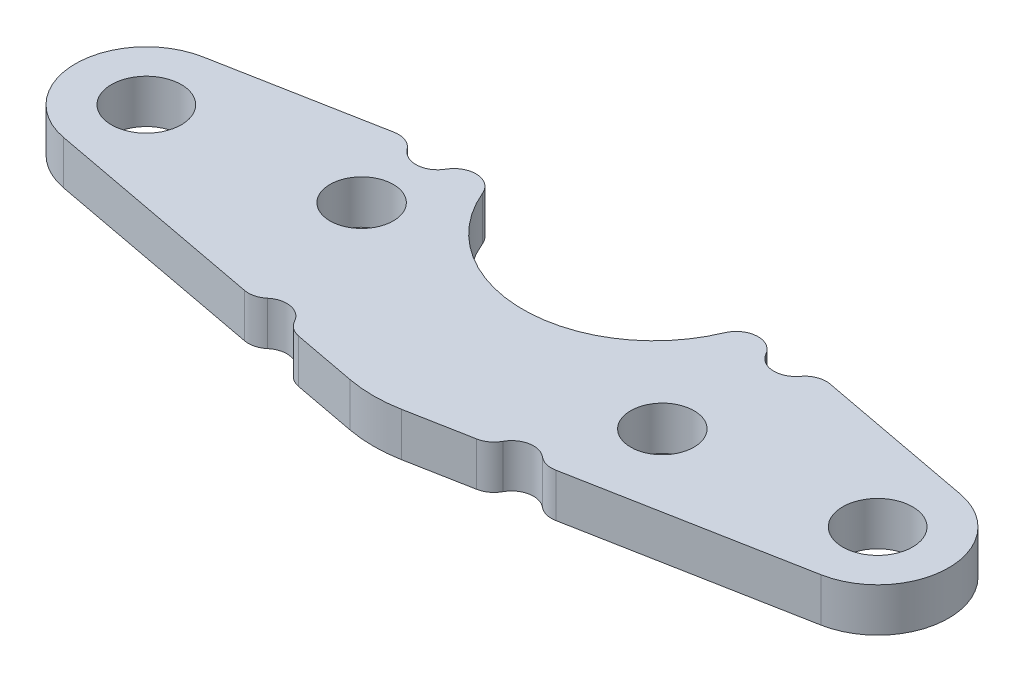
ISO-10303-21;
HEADER;
FILE_DESCRIPTION(('STEP AP214'),'2;1');
FILE_NAME('part.step','',(''),(''),'','','');
FILE_SCHEMA(('AUTOMOTIVE_DESIGN { 1 0 10303 214 1 1 1 1 }'));
ENDSEC;
DATA;
#1=APPLICATION_CONTEXT('core data for automotive mechanical design processes');
#2=APPLICATION_PROTOCOL_DEFINITION('international standard','automotive_design',2000,#1);
#3=PRODUCT_CONTEXT('',#1,'mechanical');
#4=PRODUCT('Part','Part','',(#3));
#5=PRODUCT_RELATED_PRODUCT_CATEGORY('part','',(#4));
#6=PRODUCT_DEFINITION_FORMATION('','',#4);
#7=PRODUCT_DEFINITION_CONTEXT('part definition',#1,'design');
#8=PRODUCT_DEFINITION('design','',#6,#7);
#9=PRODUCT_DEFINITION_SHAPE('','',#8);
#10=(LENGTH_UNIT() NAMED_UNIT(*) SI_UNIT(.MILLI.,.METRE.));
#11=(NAMED_UNIT(*) PLANE_ANGLE_UNIT() SI_UNIT($,.RADIAN.));
#12=(NAMED_UNIT(*) SI_UNIT($,.STERADIAN.) SOLID_ANGLE_UNIT());
#13=UNCERTAINTY_MEASURE_WITH_UNIT(LENGTH_MEASURE(1.E-05),#10,'distance_accuracy_value','');
#14=(GEOMETRIC_REPRESENTATION_CONTEXT(3) GLOBAL_UNCERTAINTY_ASSIGNED_CONTEXT((#13)) GLOBAL_UNIT_ASSIGNED_CONTEXT((#10,
#11,#12)) REPRESENTATION_CONTEXT('',''));
#15=CARTESIAN_POINT('',(0.,0.,0.));
#16=DIRECTION('',(0.,0.,1.));
#17=DIRECTION('',(1.,0.,0.));
#18=AXIS2_PLACEMENT_3D('',#15,#16,#17);
#19=CARTESIAN_POINT('',(-9.80076612799552,0.,-3.59802218391572));
#20=DIRECTION('',(0.,1.,0.));
#21=DIRECTION('',(0.,0.,1.));
#22=AXIS2_PLACEMENT_3D('',#19,#20,#21);
#23=CYLINDRICAL_SURFACE('',#22,1.);
#24=CARTESIAN_POINT('',(-9.80076612799552,0.,-3.59802218391572));
#25=DIRECTION('',(0.,1.,0.));
#26=DIRECTION('',(0.,0.,1.));
#27=AXIS2_PLACEMENT_3D('',#24,#25,#26);
#28=CIRCLE('',#27,1.);
#29=CARTESIAN_POINT('',(-9.00038306399776,0.,-4.19751109195786));
#30=VERTEX_POINT('',#29);
#31=CARTESIAN_POINT('',(-9.9858063465176,0.,-4.58075313261394));
#32=VERTEX_POINT('',#31);
#33=EDGE_CURVE('E20',#30,#32,#28,.T.);
#34=ORIENTED_EDGE('',*,*,#33,.T.);
#35=DIRECTION('',(0.,1.,0.));
#36=VECTOR('',#35,1.);
#37=CARTESIAN_POINT('',(-9.9858063465176,0.,-4.58075313261394));
#38=LINE('',#37,#36);
#39=CARTESIAN_POINT('',(-9.9858063465176,2.,-4.58075313261394));
#40=VERTEX_POINT('',#39);
#41=EDGE_CURVE('E167',#40,#32,#38,.F.);
#42=ORIENTED_EDGE('',*,*,#41,.F.);
#43=CARTESIAN_POINT('',(-9.80076612799552,2.,-3.59802218391572));
#44=DIRECTION('',(0.,1.,0.));
#45=DIRECTION('',(0.,0.,1.));
#46=AXIS2_PLACEMENT_3D('',#43,#44,#45);
#47=CIRCLE('',#46,1.);
#48=CARTESIAN_POINT('',(-9.00038306399776,2.,-4.19751109195786));
#49=VERTEX_POINT('',#48);
#50=EDGE_CURVE('E345',#49,#40,#47,.T.);
#51=ORIENTED_EDGE('',*,*,#50,.F.);
#52=DIRECTION('',(0.,1.,0.));
#53=VECTOR('',#52,1.);
#54=CARTESIAN_POINT('',(-9.00038306399776,0.,-4.19751109195786));
#55=LINE('',#54,#53);
#56=EDGE_CURVE('E169',#49,#30,#55,.F.);
#57=ORIENTED_EDGE('',*,*,#56,.T.);
#58=EDGE_LOOP('',(#34,#42,#51,#57));
#59=FACE_BOUND('',#58,.T.);
#60=ADVANCED_FACE('F17',(#59),#23,.T.);
#61=CARTESIAN_POINT('',(-6.94101291776606,0.,4.13649037771896));
#62=DIRECTION('',(0.,1.,0.));
#63=DIRECTION('',(0.,0.,1.));
#64=AXIS2_PLACEMENT_3D('',#61,#62,#63);
#65=CYLINDRICAL_SURFACE('',#64,1.);
#66=CARTESIAN_POINT('',(-6.94101291776606,0.,4.13649037771896));
#67=DIRECTION('',(0.,1.,0.));
#68=DIRECTION('',(0.,0.,1.));
#69=AXIS2_PLACEMENT_3D('',#66,#67,#68);
#70=CIRCLE('',#69,1.);
#71=CARTESIAN_POINT('',(-7.12605313628814,0.,5.11922132641718));
#72=VERTEX_POINT('',#71);
#73=CARTESIAN_POINT('',(-6.29550645888303,0.,4.90024518885948));
#74=VERTEX_POINT('',#73);
#75=EDGE_CURVE('E171',#72,#74,#70,.T.);
#76=ORIENTED_EDGE('',*,*,#75,.T.);
#77=DIRECTION('',(0.,1.,0.));
#78=VECTOR('',#77,1.);
#79=CARTESIAN_POINT('',(-6.29550645888303,0.,4.90024518885948));
#80=LINE('',#79,#78);
#81=CARTESIAN_POINT('',(-6.29550645888303,2.,4.90024518885948));
#82=VERTEX_POINT('',#81);
#83=EDGE_CURVE('E244',#74,#82,#80,.T.);
#84=ORIENTED_EDGE('',*,*,#83,.T.);
#85=CARTESIAN_POINT('',(-6.94101291776606,2.,4.13649037771896));
#86=DIRECTION('',(0.,1.,0.));
#87=DIRECTION('',(0.,0.,1.));
#88=AXIS2_PLACEMENT_3D('',#85,#86,#87);
#89=CIRCLE('',#88,1.);
#90=CARTESIAN_POINT('',(-7.12605313628814,2.,5.11922132641719));
#91=VERTEX_POINT('',#90);
#92=EDGE_CURVE('E343',#91,#82,#89,.T.);
#93=ORIENTED_EDGE('',*,*,#92,.F.);
#94=DIRECTION('',(0.,1.,0.));
#95=VECTOR('',#94,1.);
#96=CARTESIAN_POINT('',(-7.12605313628814,0.,5.11922132641719));
#97=LINE('',#96,#95);
#98=EDGE_CURVE('E254',#72,#91,#97,.T.);
#99=ORIENTED_EDGE('',*,*,#98,.F.);
#100=EDGE_LOOP('',(#76,#84,#93,#99));
#101=FACE_BOUND('',#100,.T.);
#102=ADVANCED_FACE('F357',(#101),#65,.T.);
#103=CARTESIAN_POINT('',(-3.89185613414746,0.,4.71062171885181));
#104=DIRECTION('',(0.,1.,0.));
#105=DIRECTION('',(0.,0.,1.));
#106=AXIS2_PLACEMENT_3D('',#103,#104,#105);
#107=CYLINDRICAL_SURFACE('',#106,1.);
#108=CARTESIAN_POINT('',(-3.89185613414746,0.,4.71062171885181));
#109=DIRECTION('',(0.,1.,0.));
#110=DIRECTION('',(0.,0.,1.));
#111=AXIS2_PLACEMENT_3D('',#108,#109,#110);
#112=CIRCLE('',#111,1.);
#113=CARTESIAN_POINT('',(-4.77092806707373,0.,5.1873108594259));
#114=VERTEX_POINT('',#113);
#115=CARTESIAN_POINT('',(-4.07689635266954,0.,5.69335266755003));
#116=VERTEX_POINT('',#115);
#117=EDGE_CURVE('E353',#114,#116,#112,.T.);
#118=ORIENTED_EDGE('',*,*,#117,.T.);
#119=DIRECTION('',(0.,1.,0.));
#120=VECTOR('',#119,1.);
#121=CARTESIAN_POINT('',(-4.07689635266954,0.,5.69335266755003));
#122=LINE('',#121,#120);
#123=CARTESIAN_POINT('',(-4.07689635266954,2.,5.69335266755003));
#124=VERTEX_POINT('',#123);
#125=EDGE_CURVE('E240',#124,#116,#122,.F.);
#126=ORIENTED_EDGE('',*,*,#125,.F.);
#127=CARTESIAN_POINT('',(-3.89185613414746,2.,4.71062171885181));
#128=DIRECTION('',(0.,1.,0.));
#129=DIRECTION('',(0.,0.,1.));
#130=AXIS2_PLACEMENT_3D('',#127,#128,#129);
#131=CIRCLE('',#130,1.);
#132=CARTESIAN_POINT('',(-4.77092806707373,2.,5.1873108594259));
#133=VERTEX_POINT('',#132);
#134=EDGE_CURVE('E341',#133,#124,#131,.T.);
#135=ORIENTED_EDGE('',*,*,#134,.F.);
#136=DIRECTION('',(0.,1.,0.));
#137=VECTOR('',#136,1.);
#138=CARTESIAN_POINT('',(-4.77092806707373,0.,5.1873108594259));
#139=LINE('',#138,#137);
#140=EDGE_CURVE('E245',#133,#114,#139,.F.);
#141=ORIENTED_EDGE('',*,*,#140,.T.);
#142=EDGE_LOOP('',(#118,#126,#135,#141));
#143=FACE_BOUND('',#142,.T.);
#144=ADVANCED_FACE('F370',(#143),#107,.T.);
#145=CARTESIAN_POINT('',(3.89185613414746,0.,4.71062171885181));
#146=DIRECTION('',(0.,1.,0.));
#147=DIRECTION('',(0.,0.,1.));
#148=AXIS2_PLACEMENT_3D('',#145,#146,#147);
#149=CYLINDRICAL_SURFACE('',#148,1.);
#150=CARTESIAN_POINT('',(3.89185613414746,0.,4.71062171885181));
#151=DIRECTION('',(0.,1.,0.));
#152=DIRECTION('',(0.,0.,1.));
#153=AXIS2_PLACEMENT_3D('',#150,#151,#152);
#154=CIRCLE('',#153,1.);
#155=CARTESIAN_POINT('',(4.07689635266954,0.,5.69335266755003));
#156=VERTEX_POINT('',#155);
#157=CARTESIAN_POINT('',(4.77092806707373,0.,5.1873108594259));
#158=VERTEX_POINT('',#157);
#159=EDGE_CURVE('E351',#156,#158,#154,.T.);
#160=ORIENTED_EDGE('',*,*,#159,.T.);
#161=DIRECTION('',(0.,1.,0.));
#162=VECTOR('',#161,1.);
#163=CARTESIAN_POINT('',(4.77092806707373,0.,5.1873108594259));
#164=LINE('',#163,#162);
#165=CARTESIAN_POINT('',(4.77092806707373,2.,5.1873108594259));
#166=VERTEX_POINT('',#165);
#167=EDGE_CURVE('E229',#158,#166,#164,.T.);
#168=ORIENTED_EDGE('',*,*,#167,.T.);
#169=CARTESIAN_POINT('',(3.89185613414746,2.,4.71062171885181));
#170=DIRECTION('',(0.,1.,0.));
#171=DIRECTION('',(0.,0.,1.));
#172=AXIS2_PLACEMENT_3D('',#169,#170,#171);
#173=CIRCLE('',#172,1.);
#174=CARTESIAN_POINT('',(4.07689635266954,2.,5.69335266755003));
#175=VERTEX_POINT('',#174);
#176=EDGE_CURVE('E339',#175,#166,#173,.T.);
#177=ORIENTED_EDGE('',*,*,#176,.F.);
#178=DIRECTION('',(0.,1.,0.));
#179=VECTOR('',#178,1.);
#180=CARTESIAN_POINT('',(4.07689635266954,0.,5.69335266755003));
#181=LINE('',#180,#179);
#182=EDGE_CURVE('E235',#156,#175,#181,.T.);
#183=ORIENTED_EDGE('',*,*,#182,.F.);
#184=EDGE_LOOP('',(#160,#168,#177,#183));
#185=FACE_BOUND('',#184,.T.);
#186=ADVANCED_FACE('F439',(#185),#149,.T.);
#187=CARTESIAN_POINT('',(6.94101291776606,0.,4.13649037771896));
#188=DIRECTION('',(0.,1.,0.));
#189=DIRECTION('',(0.,0.,1.));
#190=AXIS2_PLACEMENT_3D('',#187,#188,#189);
#191=CYLINDRICAL_SURFACE('',#190,1.);
#192=CARTESIAN_POINT('',(6.94101291776606,0.,4.13649037771896));
#193=DIRECTION('',(0.,1.,0.));
#194=DIRECTION('',(0.,0.,1.));
#195=AXIS2_PLACEMENT_3D('',#192,#193,#194);
#196=CIRCLE('',#195,1.);
#197=CARTESIAN_POINT('',(6.29550645888303,0.,4.90024518885948));
#198=VERTEX_POINT('',#197);
#199=CARTESIAN_POINT('',(7.12605313628814,0.,5.11922132641718));
#200=VERTEX_POINT('',#199);
#201=EDGE_CURVE('E349',#198,#200,#196,.T.);
#202=ORIENTED_EDGE('',*,*,#201,.T.);
#203=DIRECTION('',(0.,1.,0.));
#204=VECTOR('',#203,1.);
#205=CARTESIAN_POINT('',(7.12605313628814,0.,5.11922132641718));
#206=LINE('',#205,#204);
#207=CARTESIAN_POINT('',(7.12605313628814,2.,5.11922132641718));
#208=VERTEX_POINT('',#207);
#209=EDGE_CURVE('E221',#208,#200,#206,.F.);
#210=ORIENTED_EDGE('',*,*,#209,.F.);
#211=CARTESIAN_POINT('',(6.94101291776606,2.,4.13649037771896));
#212=DIRECTION('',(0.,1.,0.));
#213=DIRECTION('',(0.,0.,1.));
#214=AXIS2_PLACEMENT_3D('',#211,#212,#213);
#215=CIRCLE('',#214,1.);
#216=CARTESIAN_POINT('',(6.29550645888303,2.,4.90024518885948));
#217=VERTEX_POINT('',#216);
#218=EDGE_CURVE('E337',#217,#208,#215,.T.);
#219=ORIENTED_EDGE('',*,*,#218,.F.);
#220=DIRECTION('',(0.,1.,0.));
#221=VECTOR('',#220,1.);
#222=CARTESIAN_POINT('',(6.29550645888303,0.,4.90024518885948));
#223=LINE('',#222,#221);
#224=EDGE_CURVE('E225',#217,#198,#223,.F.);
#225=ORIENTED_EDGE('',*,*,#224,.T.);
#226=EDGE_LOOP('',(#202,#210,#219,#225));
#227=FACE_BOUND('',#226,.T.);
#228=ADVANCED_FACE('F445',(#227),#191,.T.);
#229=CARTESIAN_POINT('',(9.80076612799552,0.,-3.59802218391572));
#230=DIRECTION('',(0.,1.,0.));
#231=DIRECTION('',(0.,0.,1.));
#232=AXIS2_PLACEMENT_3D('',#229,#230,#231);
#233=CYLINDRICAL_SURFACE('',#232,1.);
#234=CARTESIAN_POINT('',(9.80076612799552,0.,-3.59802218391572));
#235=DIRECTION('',(0.,1.,0.));
#236=DIRECTION('',(0.,0.,1.));
#237=AXIS2_PLACEMENT_3D('',#234,#235,#236);
#238=CIRCLE('',#237,1.);
#239=CARTESIAN_POINT('',(9.9858063465176,0.,-4.58075313261394));
#240=VERTEX_POINT('',#239);
#241=CARTESIAN_POINT('',(9.00038306399776,0.,-4.19751109195786));
#242=VERTEX_POINT('',#241);
#243=EDGE_CURVE('E347',#240,#242,#238,.T.);
#244=ORIENTED_EDGE('',*,*,#243,.T.);
#245=DIRECTION('',(0.,1.,0.));
#246=VECTOR('',#245,1.);
#247=CARTESIAN_POINT('',(9.00038306399776,0.,-4.19751109195786));
#248=LINE('',#247,#246);
#249=CARTESIAN_POINT('',(9.00038306399776,2.,-4.19751109195786));
#250=VERTEX_POINT('',#249);
#251=EDGE_CURVE('E209',#242,#250,#248,.T.);
#252=ORIENTED_EDGE('',*,*,#251,.T.);
#253=CARTESIAN_POINT('',(9.80076612799552,2.,-3.59802218391572));
#254=DIRECTION('',(0.,1.,0.));
#255=DIRECTION('',(0.,0.,1.));
#256=AXIS2_PLACEMENT_3D('',#253,#254,#255);
#257=CIRCLE('',#256,1.);
#258=CARTESIAN_POINT('',(9.9858063465176,2.,-4.58075313261395));
#259=VERTEX_POINT('',#258);
#260=EDGE_CURVE('E335',#259,#250,#257,.T.);
#261=ORIENTED_EDGE('',*,*,#260,.F.);
#262=DIRECTION('',(0.,1.,0.));
#263=VECTOR('',#262,1.);
#264=CARTESIAN_POINT('',(9.9858063465176,0.,-4.58075313261395));
#265=LINE('',#264,#263);
#266=EDGE_CURVE('E216',#240,#259,#265,.T.);
#267=ORIENTED_EDGE('',*,*,#266,.F.);
#268=EDGE_LOOP('',(#244,#252,#261,#267));
#269=FACE_BOUND('',#268,.T.);
#270=ADVANCED_FACE('F399',(#269),#233,.T.);
#271=CARTESIAN_POINT('',(-16.75,2.,0.));
#272=DIRECTION('',(0.,1.,0.));
#273=DIRECTION('',(0.,0.,1.));
#274=AXIS2_PLACEMENT_3D('',#271,#272,#273);
#275=PLANE('',#274);
#276=CARTESIAN_POINT('',(-16.75,2.,0.));
#277=DIRECTION('',(0.,1.,0.));
#278=DIRECTION('',(0.,0.,1.));
#279=AXIS2_PLACEMENT_3D('',#276,#277,#278);
#280=CIRCLE('',#279,1.6);
#281=CARTESIAN_POINT('',(-16.75,2.,1.6));
#282=VERTEX_POINT('',#281);
#283=EDGE_CURVE('E191',#282,#282,#280,.F.);
#284=ORIENTED_EDGE('',*,*,#283,.T.);
#285=EDGE_LOOP('',(#284));
#286=FACE_BOUND('',#285,.T.);
#287=CARTESIAN_POINT('',(16.75,2.,0.));
#288=DIRECTION('',(0.,1.,0.));
#289=DIRECTION('',(0.,0.,1.));
#290=AXIS2_PLACEMENT_3D('',#287,#288,#289);
#291=CIRCLE('',#290,1.6);
#292=CARTESIAN_POINT('',(16.75,2.,1.6));
#293=VERTEX_POINT('',#292);
#294=EDGE_CURVE('E309',#293,#293,#291,.F.);
#295=ORIENTED_EDGE('',*,*,#294,.T.);
#296=EDGE_LOOP('',(#295));
#297=FACE_BOUND('',#296,.T.);
#298=CARTESIAN_POINT('',(7.93155889099048,2.,1.04420953776041));
#299=DIRECTION('',(0.,1.,0.));
#300=DIRECTION('',(0.,0.,1.));
#301=AXIS2_PLACEMENT_3D('',#298,#299,#300);
#302=CIRCLE('',#301,1.45);
#303=CARTESIAN_POINT('',(7.93155889099048,2.,2.49420953776041));
#304=VERTEX_POINT('',#303);
#305=EDGE_CURVE('E313',#304,#304,#302,.F.);
#306=ORIENTED_EDGE('',*,*,#305,.T.);
#307=EDGE_LOOP('',(#306));
#308=FACE_BOUND('',#307,.T.);
#309=CARTESIAN_POINT('',(-7.93155889099048,2.,-1.04420953776041));
#310=DIRECTION('',(0.,1.,0.));
#311=DIRECTION('',(0.,0.,1.));
#312=AXIS2_PLACEMENT_3D('',#309,#310,#311);
#313=CIRCLE('',#312,1.45);
#314=CARTESIAN_POINT('',(-7.93155889099048,2.,0.40579046223959));
#315=VERTEX_POINT('',#314);
#316=EDGE_CURVE('E197',#315,#315,#313,.F.);
#317=ORIENTED_EDGE('',*,*,#316,.T.);
#318=EDGE_LOOP('',(#317));
#319=FACE_BOUND('',#318,.T.);
#320=CARTESIAN_POINT('',(6.46165739404907,2.,-3.80797776347762));
#321=DIRECTION('',(0.,1.,0.));
#322=DIRECTION('',(0.,0.,1.));
#323=AXIS2_PLACEMENT_3D('',#320,#321,#322);
#324=CIRCLE('',#323,1.);
#325=CARTESIAN_POINT('',(5.53856348061349,2.,-4.1925523686951));
#326=VERTEX_POINT('',#325);
#327=CARTESIAN_POINT('',(7.33082869702453,2.,-4.30248888173881));
#328=VERTEX_POINT('',#327);
#329=EDGE_CURVE('E208',#326,#328,#324,.F.);
#330=ORIENTED_EDGE('',*,*,#329,.F.);
#331=CARTESIAN_POINT('',(0.,2.,-6.5));
#332=DIRECTION('',(0.,1.,0.));
#333=DIRECTION('',(0.,0.,1.));
#334=AXIS2_PLACEMENT_3D('',#331,#332,#333);
#335=CIRCLE('',#334,6.);
#336=CARTESIAN_POINT('',(-5.53856348061349,2.,-4.1925523686951));
#337=VERTEX_POINT('',#336);
#338=EDGE_CURVE('E202',#326,#337,#335,.F.);
#339=ORIENTED_EDGE('',*,*,#338,.T.);
#340=CARTESIAN_POINT('',(-6.46165739404907,2.,-3.80797776347762));
#341=DIRECTION('',(0.,1.,0.));
#342=DIRECTION('',(0.,0.,1.));
#343=AXIS2_PLACEMENT_3D('',#340,#341,#342);
#344=CIRCLE('',#343,0.999999999999999);
#345=CARTESIAN_POINT('',(-7.33082869702453,2.,-4.30248888173881));
#346=VERTEX_POINT('',#345);
#347=EDGE_CURVE('E198',#346,#337,#344,.F.);
#348=ORIENTED_EDGE('',*,*,#347,.F.);
#349=CARTESIAN_POINT('',(-8.2,2.,-4.797));
#350=DIRECTION('',(0.,1.,0.));
#351=DIRECTION('',(0.,0.,1.));
#352=AXIS2_PLACEMENT_3D('',#349,#350,#351);
#353=CIRCLE('',#352,1.);
#354=EDGE_CURVE('E260',#346,#49,#353,.F.);
#355=ORIENTED_EDGE('',*,*,#354,.T.);
#356=ORIENTED_EDGE('',*,*,#50,.T.);
#357=DIRECTION('',(-0.982730948698219,0.,0.185040218522078));
#358=VECTOR('',#357,1.);
#359=CARTESIAN_POINT('',(-9.19769539700239,2.,-4.72914799339564));
#360=LINE('',#359,#358);
#361=CARTESIAN_POINT('',(-17.3513807101968,2.,-3.19387558326921));
#362=VERTEX_POINT('',#361);
#363=EDGE_CURVE('E179',#362,#40,#360,.F.);
#364=ORIENTED_EDGE('',*,*,#363,.F.);
#365=CARTESIAN_POINT('',(-16.75,2.,0.));
#366=DIRECTION('',(0.,1.,0.));
#367=DIRECTION('',(0.,0.,1.));
#368=AXIS2_PLACEMENT_3D('',#365,#366,#367);
#369=CIRCLE('',#368,3.25);
#370=CARTESIAN_POINT('',(-17.3513807101968,2.,3.19387558326921));
#371=VERTEX_POINT('',#370);
#372=EDGE_CURVE('E257',#371,#362,#369,.F.);
#373=ORIENTED_EDGE('',*,*,#372,.F.);
#374=DIRECTION('',(0.982730948698219,0.,0.185040218522078));
#375=VECTOR('',#374,1.);
#376=CARTESIAN_POINT('',(-17.3513807101968,2.,3.19387558326921));
#377=LINE('',#376,#375);
#378=EDGE_CURVE('E253',#91,#371,#377,.F.);
#379=ORIENTED_EDGE('',*,*,#378,.F.);
#380=ORIENTED_EDGE('',*,*,#92,.T.);
#381=CARTESIAN_POINT('',(-5.65,2.,5.664));
#382=DIRECTION('',(0.,1.,0.));
#383=DIRECTION('',(0.,0.,1.));
#384=AXIS2_PLACEMENT_3D('',#381,#382,#383);
#385=CIRCLE('',#384,1.);
#386=EDGE_CURVE('E248',#82,#133,#385,.F.);
#387=ORIENTED_EDGE('',*,*,#386,.T.);
#388=ORIENTED_EDGE('',*,*,#134,.T.);
#389=DIRECTION('',(0.982730948698219,0.,0.185040218522078));
#390=VECTOR('',#389,1.);
#391=CARTESIAN_POINT('',(-4.65313718558666,2.,5.58485122085643));
#392=LINE('',#391,#390);
#393=CARTESIAN_POINT('',(-1.17489874158095,2.,6.2397751373193));
#394=VERTEX_POINT('',#393);
#395=EDGE_CURVE('E243',#394,#124,#392,.F.);
#396=ORIENTED_EDGE('',*,*,#395,.F.);
#397=CARTESIAN_POINT('',(0.,2.,0.));
#398=DIRECTION('',(0.,1.,0.));
#399=DIRECTION('',(0.,0.,1.));
#400=AXIS2_PLACEMENT_3D('',#397,#398,#399);
#401=CIRCLE('',#400,6.34942366024481);
#402=CARTESIAN_POINT('',(1.17489874158095,2.,6.2397751373193));
#403=VERTEX_POINT('',#402);
#404=EDGE_CURVE('E239',#403,#394,#401,.F.);
#405=ORIENTED_EDGE('',*,*,#404,.F.);
#406=DIRECTION('',(0.982730948698219,0.,-0.185040218522078));
#407=VECTOR('',#406,1.);
#408=CARTESIAN_POINT('',(1.17489874158095,2.,6.2397751373193));
#409=LINE('',#408,#407);
#410=EDGE_CURVE('E234',#175,#403,#409,.F.);
#411=ORIENTED_EDGE('',*,*,#410,.F.);
#412=ORIENTED_EDGE('',*,*,#176,.T.);
#413=CARTESIAN_POINT('',(5.65,2.,5.664));
#414=DIRECTION('',(0.,1.,0.));
#415=DIRECTION('',(0.,0.,1.));
#416=AXIS2_PLACEMENT_3D('',#413,#414,#415);
#417=CIRCLE('',#416,1.);
#418=EDGE_CURVE('E228',#166,#217,#417,.F.);
#419=ORIENTED_EDGE('',*,*,#418,.T.);
#420=ORIENTED_EDGE('',*,*,#218,.T.);
#421=DIRECTION('',(0.982730948698219,0.,-0.185040218522078));
#422=VECTOR('',#421,1.);
#423=CARTESIAN_POINT('',(6.54981230337102,2.,5.22772277311078));
#424=LINE('',#423,#422);
#425=CARTESIAN_POINT('',(17.3513807101968,2.,3.19387558326921));
#426=VERTEX_POINT('',#425);
#427=EDGE_CURVE('E224',#426,#208,#424,.F.);
#428=ORIENTED_EDGE('',*,*,#427,.F.);
#429=CARTESIAN_POINT('',(16.75,2.,0.));
#430=DIRECTION('',(0.,1.,0.));
#431=DIRECTION('',(0.,0.,1.));
#432=AXIS2_PLACEMENT_3D('',#429,#430,#431);
#433=CIRCLE('',#432,3.25);
#434=CARTESIAN_POINT('',(17.3513807101968,2.,-3.19387558326921));
#435=VERTEX_POINT('',#434);
#436=EDGE_CURVE('E220',#435,#426,#433,.F.);
#437=ORIENTED_EDGE('',*,*,#436,.F.);
#438=DIRECTION('',(-0.982730948698219,0.,-0.185040218522078));
#439=VECTOR('',#438,1.);
#440=CARTESIAN_POINT('',(17.3513807101968,2.,-3.19387558326921));
#441=LINE('',#440,#439);
#442=EDGE_CURVE('E215',#259,#435,#441,.F.);
#443=ORIENTED_EDGE('',*,*,#442,.F.);
#444=ORIENTED_EDGE('',*,*,#260,.T.);
#445=CARTESIAN_POINT('',(8.2,2.,-4.797));
#446=DIRECTION('',(0.,1.,0.));
#447=DIRECTION('',(0.,0.,1.));
#448=AXIS2_PLACEMENT_3D('',#445,#446,#447);
#449=CIRCLE('',#448,1.);
#450=EDGE_CURVE('E212',#250,#328,#449,.F.);
#451=ORIENTED_EDGE('',*,*,#450,.T.);
#452=EDGE_LOOP('',(#330,#339,#348,#355,#356,#364,#373,#379,#380,#387,#388,#396,#405,#411,#412,
#419,#420,#428,#437,#443,#444,#451));
#453=FACE_BOUND('',#452,.T.);
#454=ADVANCED_FACE('F372',(#286,#297,#308,#319,#453),#275,.T.);
#455=CARTESIAN_POINT('',(-8.2,0.,-4.797));
#456=DIRECTION('',(0.,1.,0.));
#457=DIRECTION('',(0.,0.,1.));
#458=AXIS2_PLACEMENT_3D('',#455,#456,#457);
#459=CYLINDRICAL_SURFACE('',#458,1.);
#460=CARTESIAN_POINT('',(-8.2,0.,-4.797));
#461=DIRECTION('',(0.,1.,0.));
#462=DIRECTION('',(0.,0.,1.));
#463=AXIS2_PLACEMENT_3D('',#460,#461,#462);
#464=CIRCLE('',#463,1.);
#465=CARTESIAN_POINT('',(-7.33082869702453,0.,-4.30248888173881));
#466=VERTEX_POINT('',#465);
#467=EDGE_CURVE('E187',#466,#30,#464,.F.);
#468=ORIENTED_EDGE('',*,*,#467,.T.);
#469=ORIENTED_EDGE('',*,*,#56,.F.);
#470=ORIENTED_EDGE('',*,*,#354,.F.);
#471=DIRECTION('',(0.,1.,0.));
#472=VECTOR('',#471,1.);
#473=CARTESIAN_POINT('',(-7.33082869702453,0.,-4.30248888173881));
#474=LINE('',#473,#472);
#475=EDGE_CURVE('E199',#466,#346,#474,.T.);
#476=ORIENTED_EDGE('',*,*,#475,.F.);
#477=EDGE_LOOP('',(#468,#469,#470,#476));
#478=FACE_BOUND('',#477,.T.);
#479=ADVANCED_FACE('F383',(#478),#459,.F.);
#480=CARTESIAN_POINT('',(-9.19769539700239,0.,-4.72914799339564));
#481=DIRECTION('',(-0.185040218522078,0.,-0.982730948698219));
#482=DIRECTION('',(-0.982730948698219,0.,0.185040218522078));
#483=AXIS2_PLACEMENT_3D('',#480,#481,#482);
#484=PLANE('',#483);
#485=DIRECTION('',(0.,1.,0.));
#486=VECTOR('',#485,1.);
#487=CARTESIAN_POINT('',(-17.3513807101968,0.,-3.1938755832692));
#488=LINE('',#487,#486);
#489=CARTESIAN_POINT('',(-17.3513807101968,0.,-3.19387558326921));
#490=VERTEX_POINT('',#489);
#491=EDGE_CURVE('E256',#362,#490,#488,.F.);
#492=ORIENTED_EDGE('',*,*,#491,.F.);
#493=ORIENTED_EDGE('',*,*,#363,.T.);
#494=ORIENTED_EDGE('',*,*,#41,.T.);
#495=DIRECTION('',(-0.982730948698219,0.,0.185040218522077));
#496=VECTOR('',#495,1.);
#497=CARTESIAN_POINT('',(-9.9858063465176,0.,-4.58075313261394));
#498=LINE('',#497,#496);
#499=EDGE_CURVE('E177',#32,#490,#498,.T.);
#500=ORIENTED_EDGE('',*,*,#499,.T.);
#501=EDGE_LOOP('',(#492,#493,#494,#500));
#502=FACE_BOUND('',#501,.T.);
#503=ADVANCED_FACE('F176',(#502),#484,.T.);
#504=CARTESIAN_POINT('',(-16.75,0.,0.));
#505=DIRECTION('',(0.,1.,0.));
#506=DIRECTION('',(0.,0.,1.));
#507=AXIS2_PLACEMENT_3D('',#504,#505,#506);
#508=CYLINDRICAL_SURFACE('',#507,3.25);
#509=ORIENTED_EDGE('',*,*,#372,.T.);
#510=ORIENTED_EDGE('',*,*,#491,.T.);
#511=CARTESIAN_POINT('',(-16.75,0.,0.));
#512=DIRECTION('',(0.,1.,0.));
#513=DIRECTION('',(0.,0.,1.));
#514=AXIS2_PLACEMENT_3D('',#511,#512,#513);
#515=CIRCLE('',#514,3.25);
#516=CARTESIAN_POINT('',(-17.3513807101968,0.,3.19387558326921));
#517=VERTEX_POINT('',#516);
#518=EDGE_CURVE('E186',#490,#517,#515,.T.);
#519=ORIENTED_EDGE('',*,*,#518,.T.);
#520=DIRECTION('',(0.,1.,0.));
#521=VECTOR('',#520,1.);
#522=CARTESIAN_POINT('',(-17.3513807101968,0.,3.19387558326921));
#523=LINE('',#522,#521);
#524=EDGE_CURVE('E251',#371,#517,#523,.F.);
#525=ORIENTED_EDGE('',*,*,#524,.F.);
#526=EDGE_LOOP('',(#509,#510,#519,#525));
#527=FACE_BOUND('',#526,.T.);
#528=ADVANCED_FACE('F380',(#527),#508,.T.);
#529=CARTESIAN_POINT('',(-17.3513807101968,0.,3.19387558326921));
#530=DIRECTION('',(-0.185040218522078,0.,0.982730948698219));
#531=DIRECTION('',(0.982730948698219,0.,0.185040218522078));
#532=AXIS2_PLACEMENT_3D('',#529,#530,#531);
#533=PLANE('',#532);
#534=ORIENTED_EDGE('',*,*,#524,.T.);
#535=DIRECTION('',(0.982730948698219,0.,0.185040218522077));
#536=VECTOR('',#535,1.);
#537=CARTESIAN_POINT('',(-17.3513807101968,0.,3.19387558326921));
#538=LINE('',#537,#536);
#539=EDGE_CURVE('E189',#517,#72,#538,.T.);
#540=ORIENTED_EDGE('',*,*,#539,.T.);
#541=ORIENTED_EDGE('',*,*,#98,.T.);
#542=ORIENTED_EDGE('',*,*,#378,.T.);
#543=EDGE_LOOP('',(#534,#540,#541,#542));
#544=FACE_BOUND('',#543,.T.);
#545=ADVANCED_FACE('F378',(#544),#533,.T.);
#546=CARTESIAN_POINT('',(-5.65,0.,5.664));
#547=DIRECTION('',(0.,1.,0.));
#548=DIRECTION('',(0.,0.,1.));
#549=AXIS2_PLACEMENT_3D('',#546,#547,#548);
#550=CYLINDRICAL_SURFACE('',#549,1.);
#551=CARTESIAN_POINT('',(-5.65,0.,5.664));
#552=DIRECTION('',(0.,1.,0.));
#553=DIRECTION('',(0.,0.,1.));
#554=AXIS2_PLACEMENT_3D('',#551,#552,#553);
#555=CIRCLE('',#554,1.);
#556=EDGE_CURVE('E304',#74,#114,#555,.F.);
#557=ORIENTED_EDGE('',*,*,#556,.T.);
#558=ORIENTED_EDGE('',*,*,#140,.F.);
#559=ORIENTED_EDGE('',*,*,#386,.F.);
#560=ORIENTED_EDGE('',*,*,#83,.F.);
#561=EDGE_LOOP('',(#557,#558,#559,#560));
#562=FACE_BOUND('',#561,.T.);
#563=ADVANCED_FACE('F363',(#562),#550,.F.);
#564=CARTESIAN_POINT('',(-4.65313718558666,0.,5.58485122085643));
#565=DIRECTION('',(-0.185040218522078,0.,0.982730948698219));
#566=DIRECTION('',(0.982730948698219,0.,0.185040218522078));
#567=AXIS2_PLACEMENT_3D('',#564,#565,#566);
#568=PLANE('',#567);
#569=DIRECTION('',(0.,1.,0.));
#570=VECTOR('',#569,1.);
#571=CARTESIAN_POINT('',(-1.17489874158095,0.,6.2397751373193));
#572=LINE('',#571,#570);
#573=CARTESIAN_POINT('',(-1.17489874158095,0.,6.2397751373193));
#574=VERTEX_POINT('',#573);
#575=EDGE_CURVE('E237',#394,#574,#572,.F.);
#576=ORIENTED_EDGE('',*,*,#575,.F.);
#577=ORIENTED_EDGE('',*,*,#395,.T.);
#578=ORIENTED_EDGE('',*,*,#125,.T.);
#579=DIRECTION('',(0.982730948698219,0.,0.185040218522077));
#580=VECTOR('',#579,1.);
#581=CARTESIAN_POINT('',(-4.07689635266954,0.,5.69335266755003));
#582=LINE('',#581,#580);
#583=EDGE_CURVE('E303',#116,#574,#582,.T.);
#584=ORIENTED_EDGE('',*,*,#583,.T.);
#585=EDGE_LOOP('',(#576,#577,#578,#584));
#586=FACE_BOUND('',#585,.T.);
#587=ADVANCED_FACE('F425',(#586),#568,.T.);
#588=CARTESIAN_POINT('',(0.,0.,0.));
#589=DIRECTION('',(0.,1.,0.));
#590=DIRECTION('',(0.,0.,1.));
#591=AXIS2_PLACEMENT_3D('',#588,#589,#590);
#592=CYLINDRICAL_SURFACE('',#591,6.34942366024481);
#593=ORIENTED_EDGE('',*,*,#404,.T.);
#594=ORIENTED_EDGE('',*,*,#575,.T.);
#595=CARTESIAN_POINT('',(0.,0.,0.));
#596=DIRECTION('',(0.,1.,0.));
#597=DIRECTION('',(0.,0.,1.));
#598=AXIS2_PLACEMENT_3D('',#595,#596,#597);
#599=CIRCLE('',#598,6.34942366024481);
#600=CARTESIAN_POINT('',(1.17489874158095,0.,6.2397751373193));
#601=VERTEX_POINT('',#600);
#602=EDGE_CURVE('E300',#574,#601,#599,.T.);
#603=ORIENTED_EDGE('',*,*,#602,.T.);
#604=DIRECTION('',(0.,1.,0.));
#605=VECTOR('',#604,1.);
#606=CARTESIAN_POINT('',(1.17489874158095,0.,6.2397751373193));
#607=LINE('',#606,#605);
#608=EDGE_CURVE('E232',#403,#601,#607,.F.);
#609=ORIENTED_EDGE('',*,*,#608,.F.);
#610=EDGE_LOOP('',(#593,#594,#603,#609));
#611=FACE_BOUND('',#610,.T.);
#612=ADVANCED_FACE('F430',(#611),#592,.T.);
#613=CARTESIAN_POINT('',(1.17489874158095,0.,6.2397751373193));
#614=DIRECTION('',(0.185040218522078,0.,0.982730948698219));
#615=DIRECTION('',(0.982730948698219,0.,-0.185040218522078));
#616=AXIS2_PLACEMENT_3D('',#613,#614,#615);
#617=PLANE('',#616);
#618=ORIENTED_EDGE('',*,*,#608,.T.);
#619=DIRECTION('',(0.982730948698219,0.,-0.185040218522077));
#620=VECTOR('',#619,1.);
#621=CARTESIAN_POINT('',(1.17489874158095,0.,6.2397751373193));
#622=LINE('',#621,#620);
#623=EDGE_CURVE('E299',#601,#156,#622,.T.);
#624=ORIENTED_EDGE('',*,*,#623,.T.);
#625=ORIENTED_EDGE('',*,*,#182,.T.);
#626=ORIENTED_EDGE('',*,*,#410,.T.);
#627=EDGE_LOOP('',(#618,#624,#625,#626));
#628=FACE_BOUND('',#627,.T.);
#629=ADVANCED_FACE('F433',(#628),#617,.T.);
#630=CARTESIAN_POINT('',(5.65,0.,5.664));
#631=DIRECTION('',(0.,1.,0.));
#632=DIRECTION('',(0.,0.,1.));
#633=AXIS2_PLACEMENT_3D('',#630,#631,#632);
#634=CYLINDRICAL_SURFACE('',#633,1.);
#635=ORIENTED_EDGE('',*,*,#418,.F.);
#636=ORIENTED_EDGE('',*,*,#167,.F.);
#637=CARTESIAN_POINT('',(5.65,0.,5.664));
#638=DIRECTION('',(0.,1.,0.));
#639=DIRECTION('',(0.,0.,1.));
#640=AXIS2_PLACEMENT_3D('',#637,#638,#639);
#641=CIRCLE('',#640,1.);
#642=EDGE_CURVE('E296',#158,#198,#641,.F.);
#643=ORIENTED_EDGE('',*,*,#642,.T.);
#644=ORIENTED_EDGE('',*,*,#224,.F.);
#645=EDGE_LOOP('',(#635,#636,#643,#644));
#646=FACE_BOUND('',#645,.T.);
#647=ADVANCED_FACE('F443',(#646),#634,.F.);
#648=CARTESIAN_POINT('',(6.54981230337102,0.,5.22772277311078));
#649=DIRECTION('',(0.185040218522078,0.,0.982730948698219));
#650=DIRECTION('',(0.982730948698219,0.,-0.185040218522078));
#651=AXIS2_PLACEMENT_3D('',#648,#649,#650);
#652=PLANE('',#651);
#653=DIRECTION('',(0.,1.,0.));
#654=VECTOR('',#653,1.);
#655=CARTESIAN_POINT('',(17.3513807101968,0.,3.1938755832692));
#656=LINE('',#655,#654);
#657=CARTESIAN_POINT('',(17.3513807101968,0.,3.19387558326921));
#658=VERTEX_POINT('',#657);
#659=EDGE_CURVE('E218',#426,#658,#656,.F.);
#660=ORIENTED_EDGE('',*,*,#659,.F.);
#661=ORIENTED_EDGE('',*,*,#427,.T.);
#662=ORIENTED_EDGE('',*,*,#209,.T.);
#663=DIRECTION('',(0.982730948698219,0.,-0.185040218522077));
#664=VECTOR('',#663,1.);
#665=CARTESIAN_POINT('',(7.12605313628814,0.,5.11922132641718));
#666=LINE('',#665,#664);
#667=EDGE_CURVE('E295',#200,#658,#666,.T.);
#668=ORIENTED_EDGE('',*,*,#667,.T.);
#669=EDGE_LOOP('',(#660,#661,#662,#668));
#670=FACE_BOUND('',#669,.T.);
#671=ADVANCED_FACE('F416',(#670),#652,.T.);
#672=CARTESIAN_POINT('',(16.75,0.,0.));
#673=DIRECTION('',(0.,1.,0.));
#674=DIRECTION('',(0.,0.,1.));
#675=AXIS2_PLACEMENT_3D('',#672,#673,#674);
#676=CYLINDRICAL_SURFACE('',#675,3.25);
#677=ORIENTED_EDGE('',*,*,#436,.T.);
#678=ORIENTED_EDGE('',*,*,#659,.T.);
#679=CARTESIAN_POINT('',(16.75,0.,0.));
#680=DIRECTION('',(0.,1.,0.));
#681=DIRECTION('',(0.,0.,1.));
#682=AXIS2_PLACEMENT_3D('',#679,#680,#681);
#683=CIRCLE('',#682,3.25);
#684=CARTESIAN_POINT('',(17.3513807101968,0.,-3.19387558326921));
#685=VERTEX_POINT('',#684);
#686=EDGE_CURVE('E291',#658,#685,#683,.T.);
#687=ORIENTED_EDGE('',*,*,#686,.T.);
#688=DIRECTION('',(0.,1.,0.));
#689=VECTOR('',#688,1.);
#690=CARTESIAN_POINT('',(17.3513807101968,0.,-3.19387558326921));
#691=LINE('',#690,#689);
#692=EDGE_CURVE('E213',#435,#685,#691,.F.);
#693=ORIENTED_EDGE('',*,*,#692,.F.);
#694=EDGE_LOOP('',(#677,#678,#687,#693));
#695=FACE_BOUND('',#694,.T.);
#696=ADVANCED_FACE('F411',(#695),#676,.T.);
#697=CARTESIAN_POINT('',(17.3513807101968,0.,-3.19387558326921));
#698=DIRECTION('',(0.185040218522078,0.,-0.982730948698219));
#699=DIRECTION('',(-0.982730948698219,0.,-0.185040218522078));
#700=AXIS2_PLACEMENT_3D('',#697,#698,#699);
#701=PLANE('',#700);
#702=ORIENTED_EDGE('',*,*,#692,.T.);
#703=DIRECTION('',(-0.982730948698219,0.,-0.185040218522077));
#704=VECTOR('',#703,1.);
#705=CARTESIAN_POINT('',(17.3513807101968,0.,-3.19387558326921));
#706=LINE('',#705,#704);
#707=EDGE_CURVE('E290',#685,#240,#706,.T.);
#708=ORIENTED_EDGE('',*,*,#707,.T.);
#709=ORIENTED_EDGE('',*,*,#266,.T.);
#710=ORIENTED_EDGE('',*,*,#442,.T.);
#711=EDGE_LOOP('',(#702,#708,#709,#710));
#712=FACE_BOUND('',#711,.T.);
#713=ADVANCED_FACE('F446',(#712),#701,.T.);
#714=CARTESIAN_POINT('',(8.2,0.,-4.797));
#715=DIRECTION('',(0.,1.,0.));
#716=DIRECTION('',(0.,0.,1.));
#717=AXIS2_PLACEMENT_3D('',#714,#715,#716);
#718=CYLINDRICAL_SURFACE('',#717,1.);
#719=CARTESIAN_POINT('',(8.2,0.,-4.797));
#720=DIRECTION('',(0.,1.,0.));
#721=DIRECTION('',(0.,0.,1.));
#722=AXIS2_PLACEMENT_3D('',#719,#720,#721);
#723=CIRCLE('',#722,1.);
#724=CARTESIAN_POINT('',(7.33082869702453,0.,-4.30248888173881));
#725=VERTEX_POINT('',#724);
#726=EDGE_CURVE('E287',#242,#725,#723,.F.);
#727=ORIENTED_EDGE('',*,*,#726,.T.);
#728=DIRECTION('',(0.,1.,0.));
#729=VECTOR('',#728,1.);
#730=CARTESIAN_POINT('',(7.33082869702454,0.,-4.30248888173881));
#731=LINE('',#730,#729);
#732=EDGE_CURVE('E206',#328,#725,#731,.F.);
#733=ORIENTED_EDGE('',*,*,#732,.F.);
#734=ORIENTED_EDGE('',*,*,#450,.F.);
#735=ORIENTED_EDGE('',*,*,#251,.F.);
#736=EDGE_LOOP('',(#727,#733,#734,#735));
#737=FACE_BOUND('',#736,.T.);
#738=ADVANCED_FACE('F395',(#737),#718,.F.);
#739=CARTESIAN_POINT('',(6.46165739404907,0.,-3.80797776347762));
#740=DIRECTION('',(0.,1.,0.));
#741=DIRECTION('',(0.,0.,1.));
#742=AXIS2_PLACEMENT_3D('',#739,#740,#741);
#743=CYLINDRICAL_SURFACE('',#742,1.);
#744=ORIENTED_EDGE('',*,*,#329,.T.);
#745=ORIENTED_EDGE('',*,*,#732,.T.);
#746=CARTESIAN_POINT('',(6.46165739404907,0.,-3.80797776347762));
#747=DIRECTION('',(0.,1.,0.));
#748=DIRECTION('',(0.,0.,1.));
#749=AXIS2_PLACEMENT_3D('',#746,#747,#748);
#750=CIRCLE('',#749,1.);
#751=CARTESIAN_POINT('',(5.53856348061349,0.,-4.1925523686951));
#752=VERTEX_POINT('',#751);
#753=EDGE_CURVE('E284',#725,#752,#750,.T.);
#754=ORIENTED_EDGE('',*,*,#753,.T.);
#755=DIRECTION('',(0.,1.,0.));
#756=VECTOR('',#755,1.);
#757=CARTESIAN_POINT('',(5.53856348061349,0.,-4.1925523686951));
#758=LINE('',#757,#756);
#759=EDGE_CURVE('E203',#752,#326,#758,.T.);
#760=ORIENTED_EDGE('',*,*,#759,.T.);
#761=EDGE_LOOP('',(#744,#745,#754,#760));
#762=FACE_BOUND('',#761,.T.);
#763=ADVANCED_FACE('F390',(#762),#743,.T.);
#764=CARTESIAN_POINT('',(0.,0.,-6.5));
#765=DIRECTION('',(0.,1.,0.));
#766=DIRECTION('',(0.,0.,1.));
#767=AXIS2_PLACEMENT_3D('',#764,#765,#766);
#768=CYLINDRICAL_SURFACE('',#767,6.);
#769=ORIENTED_EDGE('',*,*,#338,.F.);
#770=ORIENTED_EDGE('',*,*,#759,.F.);
#771=CARTESIAN_POINT('',(0.,0.,-6.5));
#772=DIRECTION('',(0.,1.,0.));
#773=DIRECTION('',(0.,0.,1.));
#774=AXIS2_PLACEMENT_3D('',#771,#772,#773);
#775=CIRCLE('',#774,6.);
#776=CARTESIAN_POINT('',(-5.53856348061349,0.,-4.1925523686951));
#777=VERTEX_POINT('',#776);
#778=EDGE_CURVE('E281',#752,#777,#775,.F.);
#779=ORIENTED_EDGE('',*,*,#778,.T.);
#780=DIRECTION('',(0.,1.,0.));
#781=VECTOR('',#780,1.);
#782=CARTESIAN_POINT('',(-5.53856348061349,0.,-4.1925523686951));
#783=LINE('',#782,#781);
#784=EDGE_CURVE('E35',#337,#777,#783,.F.);
#785=ORIENTED_EDGE('',*,*,#784,.F.);
#786=EDGE_LOOP('',(#769,#770,#779,#785));
#787=FACE_BOUND('',#786,.T.);
#788=ADVANCED_FACE('F388',(#787),#768,.F.);
#789=CARTESIAN_POINT('',(-6.46165739404907,0.,-3.80797776347762));
#790=DIRECTION('',(0.,1.,0.));
#791=DIRECTION('',(0.,0.,1.));
#792=AXIS2_PLACEMENT_3D('',#789,#790,#791);
#793=CYLINDRICAL_SURFACE('',#792,0.999999999999999);
#794=ORIENTED_EDGE('',*,*,#347,.T.);
#795=ORIENTED_EDGE('',*,*,#784,.T.);
#796=CARTESIAN_POINT('',(-6.46165739404907,0.,-3.80797776347762));
#797=DIRECTION('',(0.,1.,0.));
#798=DIRECTION('',(0.,0.,1.));
#799=AXIS2_PLACEMENT_3D('',#796,#797,#798);
#800=CIRCLE('',#799,0.999999999999999);
#801=EDGE_CURVE('E279',#777,#466,#800,.T.);
#802=ORIENTED_EDGE('',*,*,#801,.T.);
#803=ORIENTED_EDGE('',*,*,#475,.T.);
#804=EDGE_LOOP('',(#794,#795,#802,#803));
#805=FACE_BOUND('',#804,.T.);
#806=ADVANCED_FACE('F479',(#805),#793,.T.);
#807=CARTESIAN_POINT('',(-7.93155889099048,0.,-1.04420953776041));
#808=DIRECTION('',(0.,1.,0.));
#809=DIRECTION('',(0.,0.,1.));
#810=AXIS2_PLACEMENT_3D('',#807,#808,#809);
#811=CYLINDRICAL_SURFACE('',#810,1.45);
#812=CARTESIAN_POINT('',(-7.93155889099048,0.,-1.04420953776041));
#813=DIRECTION('',(0.,1.,0.));
#814=DIRECTION('',(0.,0.,1.));
#815=AXIS2_PLACEMENT_3D('',#812,#813,#814);
#816=CIRCLE('',#815,1.45);
#817=CARTESIAN_POINT('',(-7.93155889099048,0.,0.40579046223959));
#818=VERTEX_POINT('',#817);
#819=EDGE_CURVE('E276',#818,#818,#816,.F.);
#820=ORIENTED_EDGE('',*,*,#819,.T.);
#821=EDGE_LOOP('',(#820));
#822=FACE_BOUND('',#821,.T.);
#823=ORIENTED_EDGE('',*,*,#316,.F.);
#824=EDGE_LOOP('',(#823));
#825=FACE_BOUND('',#824,.T.);
#826=ADVANCED_FACE('F475',(#822,#825),#811,.F.);
#827=CARTESIAN_POINT('',(7.93155889099048,0.,1.04420953776041));
#828=DIRECTION('',(0.,1.,0.));
#829=DIRECTION('',(0.,0.,1.));
#830=AXIS2_PLACEMENT_3D('',#827,#828,#829);
#831=CYLINDRICAL_SURFACE('',#830,1.45);
#832=CARTESIAN_POINT('',(7.93155889099048,0.,1.04420953776041));
#833=DIRECTION('',(0.,1.,0.));
#834=DIRECTION('',(0.,0.,1.));
#835=AXIS2_PLACEMENT_3D('',#832,#833,#834);
#836=CIRCLE('',#835,1.45);
#837=CARTESIAN_POINT('',(7.93155889099048,0.,2.49420953776041));
#838=VERTEX_POINT('',#837);
#839=EDGE_CURVE('E272',#838,#838,#836,.F.);
#840=ORIENTED_EDGE('',*,*,#839,.T.);
#841=EDGE_LOOP('',(#840));
#842=FACE_BOUND('',#841,.T.);
#843=ORIENTED_EDGE('',*,*,#305,.F.);
#844=EDGE_LOOP('',(#843));
#845=FACE_BOUND('',#844,.T.);
#846=ADVANCED_FACE('F471',(#842,#845),#831,.F.);
#847=CARTESIAN_POINT('',(16.75,0.,0.));
#848=DIRECTION('',(0.,1.,0.));
#849=DIRECTION('',(0.,0.,1.));
#850=AXIS2_PLACEMENT_3D('',#847,#848,#849);
#851=CYLINDRICAL_SURFACE('',#850,1.6);
#852=CARTESIAN_POINT('',(16.75,0.,0.));
#853=DIRECTION('',(0.,1.,0.));
#854=DIRECTION('',(0.,0.,1.));
#855=AXIS2_PLACEMENT_3D('',#852,#853,#854);
#856=CIRCLE('',#855,1.6);
#857=CARTESIAN_POINT('',(16.75,0.,1.6));
#858=VERTEX_POINT('',#857);
#859=EDGE_CURVE('E26',#858,#858,#856,.F.);
#860=ORIENTED_EDGE('',*,*,#859,.T.);
#861=EDGE_LOOP('',(#860));
#862=FACE_BOUND('',#861,.T.);
#863=ORIENTED_EDGE('',*,*,#294,.F.);
#864=EDGE_LOOP('',(#863));
#865=FACE_BOUND('',#864,.T.);
#866=ADVANCED_FACE('F463',(#862,#865),#851,.F.);
#867=CARTESIAN_POINT('',(-16.75,0.,0.));
#868=DIRECTION('',(0.,1.,0.));
#869=DIRECTION('',(0.,0.,1.));
#870=AXIS2_PLACEMENT_3D('',#867,#868,#869);
#871=CYLINDRICAL_SURFACE('',#870,1.6);
#872=CARTESIAN_POINT('',(-16.75,0.,0.));
#873=DIRECTION('',(0.,1.,0.));
#874=DIRECTION('',(0.,0.,1.));
#875=AXIS2_PLACEMENT_3D('',#872,#873,#874);
#876=CIRCLE('',#875,1.6);
#877=CARTESIAN_POINT('',(-16.75,0.,1.6));
#878=VERTEX_POINT('',#877);
#879=EDGE_CURVE('E11',#878,#878,#876,.F.);
#880=ORIENTED_EDGE('',*,*,#879,.T.);
#881=EDGE_LOOP('',(#880));
#882=FACE_BOUND('',#881,.T.);
#883=ORIENTED_EDGE('',*,*,#283,.F.);
#884=EDGE_LOOP('',(#883));
#885=FACE_BOUND('',#884,.T.);
#886=ADVANCED_FACE('F457',(#882,#885),#871,.F.);
#887=CARTESIAN_POINT('',(-16.75,0.,0.));
#888=DIRECTION('',(0.,1.,0.));
#889=DIRECTION('',(0.,0.,1.));
#890=AXIS2_PLACEMENT_3D('',#887,#888,#889);
#891=PLANE('',#890);
#892=ORIENTED_EDGE('',*,*,#879,.F.);
#893=EDGE_LOOP('',(#892));
#894=FACE_BOUND('',#893,.T.);
#895=ORIENTED_EDGE('',*,*,#859,.F.);
#896=EDGE_LOOP('',(#895));
#897=FACE_BOUND('',#896,.T.);
#898=ORIENTED_EDGE('',*,*,#839,.F.);
#899=EDGE_LOOP('',(#898));
#900=FACE_BOUND('',#899,.T.);
#901=ORIENTED_EDGE('',*,*,#819,.F.);
#902=EDGE_LOOP('',(#901));
#903=FACE_BOUND('',#902,.T.);
#904=ORIENTED_EDGE('',*,*,#778,.F.);
#905=ORIENTED_EDGE('',*,*,#753,.F.);
#906=ORIENTED_EDGE('',*,*,#726,.F.);
#907=ORIENTED_EDGE('',*,*,#243,.F.);
#908=ORIENTED_EDGE('',*,*,#707,.F.);
#909=ORIENTED_EDGE('',*,*,#686,.F.);
#910=ORIENTED_EDGE('',*,*,#667,.F.);
#911=ORIENTED_EDGE('',*,*,#201,.F.);
#912=ORIENTED_EDGE('',*,*,#642,.F.);
#913=ORIENTED_EDGE('',*,*,#159,.F.);
#914=ORIENTED_EDGE('',*,*,#623,.F.);
#915=ORIENTED_EDGE('',*,*,#602,.F.);
#916=ORIENTED_EDGE('',*,*,#583,.F.);
#917=ORIENTED_EDGE('',*,*,#117,.F.);
#918=ORIENTED_EDGE('',*,*,#556,.F.);
#919=ORIENTED_EDGE('',*,*,#75,.F.);
#920=ORIENTED_EDGE('',*,*,#539,.F.);
#921=ORIENTED_EDGE('',*,*,#518,.F.);
#922=ORIENTED_EDGE('',*,*,#499,.F.);
#923=ORIENTED_EDGE('',*,*,#33,.F.);
#924=ORIENTED_EDGE('',*,*,#467,.F.);
#925=ORIENTED_EDGE('',*,*,#801,.F.);
#926=EDGE_LOOP('',(#904,#905,#906,#907,#908,#909,#910,#911,#912,#913,#914,#915,#916,#917,#918,
#919,#920,#921,#922,#923,#924,#925));
#927=FACE_BOUND('',#926,.T.);
#928=ADVANCED_FACE('F183',(#894,#897,#900,#903,#927),#891,.F.);
#929=CLOSED_SHELL('',(#60,#102,#144,#186,#228,#270,#454,#479,#503,#528,#545,#563,#587,#612,#629,
#647,#671,#696,#713,#738,#763,#788,#806,#826,#846,#866,#886,#928));
#930=MANIFOLD_SOLID_BREP('B1',#929);
#931=ADVANCED_BREP_SHAPE_REPRESENTATION('',(#18,#930),#14);
#932=SHAPE_DEFINITION_REPRESENTATION(#9,#931);
ENDSEC;
END-ISO-10303-21;
